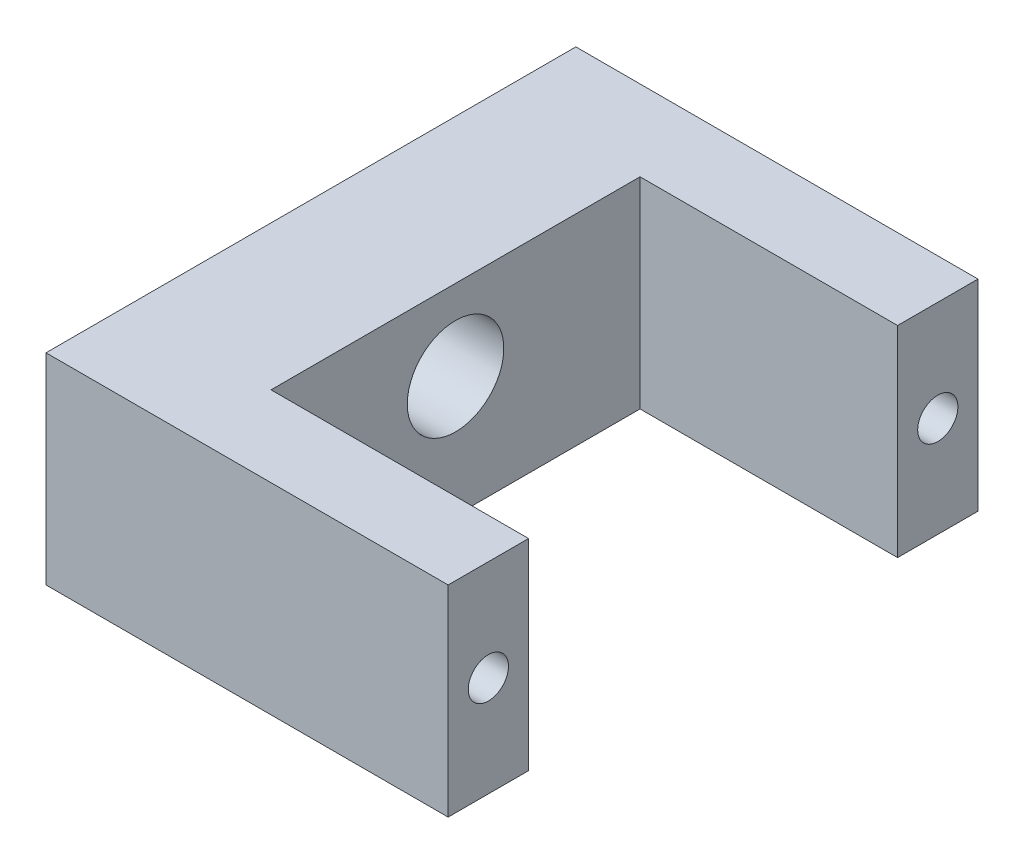
ISO-10303-21;
HEADER;
FILE_DESCRIPTION(('STEP AP214'),'2;1');
FILE_NAME('part.step','',(''),(''),'','','');
FILE_SCHEMA(('AUTOMOTIVE_DESIGN { 1 0 10303 214 1 1 1 1 }'));
ENDSEC;
DATA;
#1=APPLICATION_CONTEXT('core data for automotive mechanical design processes');
#2=APPLICATION_PROTOCOL_DEFINITION('international standard','automotive_design',2000,#1);
#3=PRODUCT_CONTEXT('',#1,'mechanical');
#4=PRODUCT('Part','Part','',(#3));
#5=PRODUCT_RELATED_PRODUCT_CATEGORY('part','',(#4));
#6=PRODUCT_DEFINITION_FORMATION('','',#4);
#7=PRODUCT_DEFINITION_CONTEXT('part definition',#1,'design');
#8=PRODUCT_DEFINITION('design','',#6,#7);
#9=PRODUCT_DEFINITION_SHAPE('','',#8);
#10=(LENGTH_UNIT() NAMED_UNIT(*) SI_UNIT(.MILLI.,.METRE.));
#11=(NAMED_UNIT(*) PLANE_ANGLE_UNIT() SI_UNIT($,.RADIAN.));
#12=(NAMED_UNIT(*) SI_UNIT($,.STERADIAN.) SOLID_ANGLE_UNIT());
#13=UNCERTAINTY_MEASURE_WITH_UNIT(LENGTH_MEASURE(1.E-05),#10,'distance_accuracy_value','');
#14=(GEOMETRIC_REPRESENTATION_CONTEXT(3) GLOBAL_UNCERTAINTY_ASSIGNED_CONTEXT((#13)) GLOBAL_UNIT_ASSIGNED_CONTEXT((#10,
#11,#12)) REPRESENTATION_CONTEXT('',''));
#15=CARTESIAN_POINT('',(0.,0.,0.));
#16=DIRECTION('',(0.,0.,1.));
#17=DIRECTION('',(1.,0.,0.));
#18=AXIS2_PLACEMENT_3D('',#15,#16,#17);
#19=CARTESIAN_POINT('',(25.,6.25,0.));
#20=DIRECTION('',(0.,0.,-1.));
#21=DIRECTION('',(-1.,0.,0.));
#22=AXIS2_PLACEMENT_3D('',#19,#20,#21);
#23=PLANE('',#22);
#24=DIRECTION('',(1.,0.,0.));
#25=VECTOR('',#24,1.);
#26=CARTESIAN_POINT('',(25.,-6.25,0.));
#27=LINE('',#26,#25);
#28=CARTESIAN_POINT('',(0.,-6.25,0.));
#29=VERTEX_POINT('',#28);
#30=CARTESIAN_POINT('',(25.,-6.25,0.));
#31=VERTEX_POINT('',#30);
#32=EDGE_CURVE('E131',#29,#31,#27,.T.);
#33=ORIENTED_EDGE('',*,*,#32,.T.);
#34=DIRECTION('',(0.,-1.,0.));
#35=VECTOR('',#34,1.);
#36=CARTESIAN_POINT('',(25.,6.25,0.));
#37=LINE('',#36,#35);
#38=CARTESIAN_POINT('',(25.,6.25,0.));
#39=VERTEX_POINT('',#38);
#40=EDGE_CURVE('E11',#39,#31,#37,.T.);
#41=ORIENTED_EDGE('',*,*,#40,.F.);
#42=DIRECTION('',(1.,0.,0.));
#43=VECTOR('',#42,1.);
#44=CARTESIAN_POINT('',(25.,6.25,0.));
#45=LINE('',#44,#43);
#46=CARTESIAN_POINT('',(0.,6.25,0.));
#47=VERTEX_POINT('',#46);
#48=EDGE_CURVE('E146',#47,#39,#45,.T.);
#49=ORIENTED_EDGE('',*,*,#48,.F.);
#50=DIRECTION('',(0.,-1.,0.));
#51=VECTOR('',#50,1.);
#52=CARTESIAN_POINT('',(0.,6.25,0.));
#53=LINE('',#52,#51);
#54=EDGE_CURVE('E127',#47,#29,#53,.T.);
#55=ORIENTED_EDGE('',*,*,#54,.T.);
#56=EDGE_LOOP('',(#33,#41,#49,#55));
#57=FACE_BOUND('',#56,.T.);
#58=ADVANCED_FACE('F35',(#57),#23,.F.);
#59=CARTESIAN_POINT('',(25.,6.25,-5.));
#60=DIRECTION('',(-1.,0.,0.));
#61=DIRECTION('',(0.,0.,1.));
#62=AXIS2_PLACEMENT_3D('',#59,#60,#61);
#63=PLANE('',#62);
#64=CARTESIAN_POINT('',(25.,0.,-2.50000000000001));
#65=DIRECTION('',(1.,0.,0.));
#66=DIRECTION('',(0.,0.,-1.));
#67=AXIS2_PLACEMENT_3D('',#64,#65,#66);
#68=CIRCLE('',#67,1.25);
#69=CARTESIAN_POINT('',(25.,0.,-3.75000000000001));
#70=VERTEX_POINT('',#69);
#71=EDGE_CURVE('E179',#70,#70,#68,.T.);
#72=ORIENTED_EDGE('',*,*,#71,.F.);
#73=EDGE_LOOP('',(#72));
#74=FACE_BOUND('',#73,.T.);
#75=DIRECTION('',(0.,0.,-1.));
#76=VECTOR('',#75,1.);
#77=CARTESIAN_POINT('',(25.,-6.25,-5.));
#78=LINE('',#77,#76);
#79=CARTESIAN_POINT('',(25.,-6.25,-5.));
#80=VERTEX_POINT('',#79);
#81=EDGE_CURVE('E134',#31,#80,#78,.T.);
#82=ORIENTED_EDGE('',*,*,#81,.T.);
#83=DIRECTION('',(0.,-1.,0.));
#84=VECTOR('',#83,1.);
#85=CARTESIAN_POINT('',(25.,6.25,-5.));
#86=LINE('',#85,#84);
#87=CARTESIAN_POINT('',(25.,6.25,-5.));
#88=VERTEX_POINT('',#87);
#89=EDGE_CURVE('E43',#88,#80,#86,.T.);
#90=ORIENTED_EDGE('',*,*,#89,.F.);
#91=DIRECTION('',(0.,0.,-1.));
#92=VECTOR('',#91,1.);
#93=CARTESIAN_POINT('',(25.,6.25,-5.));
#94=LINE('',#93,#92);
#95=EDGE_CURVE('E94',#39,#88,#94,.T.);
#96=ORIENTED_EDGE('',*,*,#95,.F.);
#97=ORIENTED_EDGE('',*,*,#40,.T.);
#98=EDGE_LOOP('',(#82,#90,#96,#97));
#99=FACE_BOUND('',#98,.T.);
#100=ADVANCED_FACE('F213',(#74,#99),#63,.F.);
#101=CARTESIAN_POINT('',(8.99,6.25,-5.));
#102=DIRECTION('',(0.,0.,1.));
#103=DIRECTION('',(1.,0.,0.));
#104=AXIS2_PLACEMENT_3D('',#101,#102,#103);
#105=PLANE('',#104);
#106=DIRECTION('',(-1.,0.,0.));
#107=VECTOR('',#106,1.);
#108=CARTESIAN_POINT('',(8.99,-6.25,-5.));
#109=LINE('',#108,#107);
#110=CARTESIAN_POINT('',(8.99,-6.25,-5.));
#111=VERTEX_POINT('',#110);
#112=EDGE_CURVE('E137',#80,#111,#109,.T.);
#113=ORIENTED_EDGE('',*,*,#112,.T.);
#114=DIRECTION('',(0.,-1.,0.));
#115=VECTOR('',#114,1.);
#116=CARTESIAN_POINT('',(8.99,6.25,-5.));
#117=LINE('',#116,#115);
#118=CARTESIAN_POINT('',(8.99,6.25,-5.));
#119=VERTEX_POINT('',#118);
#120=EDGE_CURVE('E153',#119,#111,#117,.T.);
#121=ORIENTED_EDGE('',*,*,#120,.F.);
#122=DIRECTION('',(-1.,0.,0.));
#123=VECTOR('',#122,1.);
#124=CARTESIAN_POINT('',(8.99,6.25,-5.));
#125=LINE('',#124,#123);
#126=EDGE_CURVE('E161',#88,#119,#125,.T.);
#127=ORIENTED_EDGE('',*,*,#126,.F.);
#128=ORIENTED_EDGE('',*,*,#89,.T.);
#129=EDGE_LOOP('',(#113,#121,#127,#128));
#130=FACE_BOUND('',#129,.T.);
#131=ADVANCED_FACE('F159',(#130),#105,.F.);
#132=CARTESIAN_POINT('',(8.98999999999999,6.25,-27.94));
#133=DIRECTION('',(-1.,0.,0.));
#134=DIRECTION('',(0.,0.,1.));
#135=AXIS2_PLACEMENT_3D('',#132,#133,#134);
#136=PLANE('',#135);
#137=CARTESIAN_POINT('',(8.99,1.25,-16.47));
#138=DIRECTION('',(-1.,0.,0.));
#139=DIRECTION('',(0.,0.,1.));
#140=AXIS2_PLACEMENT_3D('',#137,#138,#139);
#141=CIRCLE('',#140,3.);
#142=CARTESIAN_POINT('',(8.99,1.25,-13.47));
#143=VERTEX_POINT('',#142);
#144=EDGE_CURVE('E188',#143,#143,#141,.T.);
#145=ORIENTED_EDGE('',*,*,#144,.T.);
#146=EDGE_LOOP('',(#145));
#147=FACE_BOUND('',#146,.T.);
#148=DIRECTION('',(0.,0.,-1.));
#149=VECTOR('',#148,1.);
#150=CARTESIAN_POINT('',(8.98999999999999,-6.25,-27.94));
#151=LINE('',#150,#149);
#152=CARTESIAN_POINT('',(8.98999999999999,-6.25,-27.94));
#153=VERTEX_POINT('',#152);
#154=EDGE_CURVE('E139',#111,#153,#151,.T.);
#155=ORIENTED_EDGE('',*,*,#154,.T.);
#156=DIRECTION('',(0.,-1.,0.));
#157=VECTOR('',#156,1.);
#158=CARTESIAN_POINT('',(8.98999999999999,6.25,-27.94));
#159=LINE('',#158,#157);
#160=CARTESIAN_POINT('',(8.98999999999999,6.25,-27.94));
#161=VERTEX_POINT('',#160);
#162=EDGE_CURVE('E150',#161,#153,#159,.T.);
#163=ORIENTED_EDGE('',*,*,#162,.F.);
#164=DIRECTION('',(0.,0.,-1.));
#165=VECTOR('',#164,1.);
#166=CARTESIAN_POINT('',(8.98999999999999,6.25,-27.94));
#167=LINE('',#166,#165);
#168=EDGE_CURVE('E173',#119,#161,#167,.T.);
#169=ORIENTED_EDGE('',*,*,#168,.F.);
#170=ORIENTED_EDGE('',*,*,#120,.T.);
#171=EDGE_LOOP('',(#155,#163,#169,#170));
#172=FACE_BOUND('',#171,.T.);
#173=ADVANCED_FACE('F169',(#147,#172),#136,.F.);
#174=CARTESIAN_POINT('',(25.,6.25,-27.94));
#175=DIRECTION('',(0.,0.,-1.));
#176=DIRECTION('',(-1.,0.,0.));
#177=AXIS2_PLACEMENT_3D('',#174,#175,#176);
#178=PLANE('',#177);
#179=DIRECTION('',(1.,0.,0.));
#180=VECTOR('',#179,1.);
#181=CARTESIAN_POINT('',(25.,-6.25,-27.94));
#182=LINE('',#181,#180);
#183=CARTESIAN_POINT('',(25.,-6.25,-27.94));
#184=VERTEX_POINT('',#183);
#185=EDGE_CURVE('E141',#153,#184,#182,.T.);
#186=ORIENTED_EDGE('',*,*,#185,.T.);
#187=DIRECTION('',(0.,-1.,0.));
#188=VECTOR('',#187,1.);
#189=CARTESIAN_POINT('',(25.,6.25,-27.94));
#190=LINE('',#189,#188);
#191=CARTESIAN_POINT('',(25.,6.25,-27.94));
#192=VERTEX_POINT('',#191);
#193=EDGE_CURVE('E122',#192,#184,#190,.T.);
#194=ORIENTED_EDGE('',*,*,#193,.F.);
#195=DIRECTION('',(1.,0.,0.));
#196=VECTOR('',#195,1.);
#197=CARTESIAN_POINT('',(25.,6.25,-27.94));
#198=LINE('',#197,#196);
#199=EDGE_CURVE('E113',#161,#192,#198,.T.);
#200=ORIENTED_EDGE('',*,*,#199,.F.);
#201=ORIENTED_EDGE('',*,*,#162,.T.);
#202=EDGE_LOOP('',(#186,#194,#200,#201));
#203=FACE_BOUND('',#202,.T.);
#204=ADVANCED_FACE('F172',(#203),#178,.F.);
#205=CARTESIAN_POINT('',(25.,6.25,-32.94));
#206=DIRECTION('',(-1.,0.,0.));
#207=DIRECTION('',(0.,0.,1.));
#208=AXIS2_PLACEMENT_3D('',#205,#206,#207);
#209=PLANE('',#208);
#210=CARTESIAN_POINT('',(25.,0.,-30.44));
#211=DIRECTION('',(-1.,0.,0.));
#212=DIRECTION('',(0.,0.,1.));
#213=AXIS2_PLACEMENT_3D('',#210,#211,#212);
#214=CIRCLE('',#213,1.25);
#215=CARTESIAN_POINT('',(25.,0.,-29.19));
#216=VERTEX_POINT('',#215);
#217=EDGE_CURVE('E185',#216,#216,#214,.T.);
#218=ORIENTED_EDGE('',*,*,#217,.T.);
#219=EDGE_LOOP('',(#218));
#220=FACE_BOUND('',#219,.T.);
#221=DIRECTION('',(0.,0.,-1.));
#222=VECTOR('',#221,1.);
#223=CARTESIAN_POINT('',(25.,-6.25,-32.94));
#224=LINE('',#223,#222);
#225=CARTESIAN_POINT('',(25.,-6.25,-32.94));
#226=VERTEX_POINT('',#225);
#227=EDGE_CURVE('E121',#184,#226,#224,.T.);
#228=ORIENTED_EDGE('',*,*,#227,.T.);
#229=DIRECTION('',(0.,-1.,0.));
#230=VECTOR('',#229,1.);
#231=CARTESIAN_POINT('',(25.,6.25,-32.94));
#232=LINE('',#231,#230);
#233=CARTESIAN_POINT('',(25.,6.25,-32.94));
#234=VERTEX_POINT('',#233);
#235=EDGE_CURVE('E118',#234,#226,#232,.T.);
#236=ORIENTED_EDGE('',*,*,#235,.F.);
#237=DIRECTION('',(0.,0.,-1.));
#238=VECTOR('',#237,1.);
#239=CARTESIAN_POINT('',(25.,6.25,-32.94));
#240=LINE('',#239,#238);
#241=EDGE_CURVE('E107',#192,#234,#240,.T.);
#242=ORIENTED_EDGE('',*,*,#241,.F.);
#243=ORIENTED_EDGE('',*,*,#193,.T.);
#244=EDGE_LOOP('',(#228,#236,#242,#243));
#245=FACE_BOUND('',#244,.T.);
#246=ADVANCED_FACE('F119',(#220,#245),#209,.F.);
#247=CARTESIAN_POINT('',(0.,6.25,-32.94));
#248=DIRECTION('',(0.,0.,1.));
#249=DIRECTION('',(1.,0.,0.));
#250=AXIS2_PLACEMENT_3D('',#247,#248,#249);
#251=PLANE('',#250);
#252=DIRECTION('',(-1.,0.,0.));
#253=VECTOR('',#252,1.);
#254=CARTESIAN_POINT('',(0.,-6.25,-32.94));
#255=LINE('',#254,#253);
#256=CARTESIAN_POINT('',(0.,-6.25,-32.94));
#257=VERTEX_POINT('',#256);
#258=EDGE_CURVE('E80',#226,#257,#255,.T.);
#259=ORIENTED_EDGE('',*,*,#258,.T.);
#260=DIRECTION('',(0.,-1.,0.));
#261=VECTOR('',#260,1.);
#262=CARTESIAN_POINT('',(0.,6.25,-32.94));
#263=LINE('',#262,#261);
#264=CARTESIAN_POINT('',(0.,6.25,-32.94));
#265=VERTEX_POINT('',#264);
#266=EDGE_CURVE('E123',#265,#257,#263,.T.);
#267=ORIENTED_EDGE('',*,*,#266,.F.);
#268=DIRECTION('',(-1.,0.,0.));
#269=VECTOR('',#268,1.);
#270=CARTESIAN_POINT('',(0.,6.25,-32.94));
#271=LINE('',#270,#269);
#272=EDGE_CURVE('E111',#234,#265,#271,.T.);
#273=ORIENTED_EDGE('',*,*,#272,.F.);
#274=ORIENTED_EDGE('',*,*,#235,.T.);
#275=EDGE_LOOP('',(#259,#267,#273,#274));
#276=FACE_BOUND('',#275,.T.);
#277=ADVANCED_FACE('F125',(#276),#251,.F.);
#278=CARTESIAN_POINT('',(0.,6.25,0.));
#279=DIRECTION('',(1.,0.,0.));
#280=DIRECTION('',(0.,0.,-1.));
#281=AXIS2_PLACEMENT_3D('',#278,#279,#280);
#282=PLANE('',#281);
#283=CARTESIAN_POINT('',(0.,1.25,-16.47));
#284=DIRECTION('',(-1.,0.,0.));
#285=DIRECTION('',(0.,0.,1.));
#286=AXIS2_PLACEMENT_3D('',#283,#284,#285);
#287=CIRCLE('',#286,3.);
#288=CARTESIAN_POINT('',(0.,1.25,-13.47));
#289=VERTEX_POINT('',#288);
#290=EDGE_CURVE('E193',#289,#289,#287,.T.);
#291=ORIENTED_EDGE('',*,*,#290,.F.);
#292=EDGE_LOOP('',(#291));
#293=FACE_BOUND('',#292,.T.);
#294=DIRECTION('',(0.,0.,1.));
#295=VECTOR('',#294,1.);
#296=CARTESIAN_POINT('',(0.,-6.25,0.));
#297=LINE('',#296,#295);
#298=EDGE_CURVE('E86',#257,#29,#297,.T.);
#299=ORIENTED_EDGE('',*,*,#298,.T.);
#300=ORIENTED_EDGE('',*,*,#54,.F.);
#301=DIRECTION('',(0.,0.,1.));
#302=VECTOR('',#301,1.);
#303=CARTESIAN_POINT('',(0.,6.25,0.));
#304=LINE('',#303,#302);
#305=EDGE_CURVE('E51',#265,#47,#304,.T.);
#306=ORIENTED_EDGE('',*,*,#305,.F.);
#307=ORIENTED_EDGE('',*,*,#266,.T.);
#308=EDGE_LOOP('',(#299,#300,#306,#307));
#309=FACE_BOUND('',#308,.T.);
#310=ADVANCED_FACE('F200',(#293,#309),#282,.F.);
#311=CARTESIAN_POINT('',(0.,6.25,0.));
#312=DIRECTION('',(0.,-1.,0.));
#313=DIRECTION('',(0.,0.,-1.));
#314=AXIS2_PLACEMENT_3D('',#311,#312,#313);
#315=PLANE('',#314);
#316=ORIENTED_EDGE('',*,*,#48,.T.);
#317=ORIENTED_EDGE('',*,*,#95,.T.);
#318=ORIENTED_EDGE('',*,*,#126,.T.);
#319=ORIENTED_EDGE('',*,*,#168,.T.);
#320=ORIENTED_EDGE('',*,*,#199,.T.);
#321=ORIENTED_EDGE('',*,*,#241,.T.);
#322=ORIENTED_EDGE('',*,*,#272,.T.);
#323=ORIENTED_EDGE('',*,*,#305,.T.);
#324=EDGE_LOOP('',(#316,#317,#318,#319,#320,#321,#322,#323));
#325=FACE_BOUND('',#324,.T.);
#326=ADVANCED_FACE('F109',(#325),#315,.F.);
#327=CARTESIAN_POINT('',(0.,-6.25,0.));
#328=DIRECTION('',(0.,-1.,0.));
#329=DIRECTION('',(0.,0.,-1.));
#330=AXIS2_PLACEMENT_3D('',#327,#328,#329);
#331=PLANE('',#330);
#332=ORIENTED_EDGE('',*,*,#32,.F.);
#333=ORIENTED_EDGE('',*,*,#298,.F.);
#334=ORIENTED_EDGE('',*,*,#258,.F.);
#335=ORIENTED_EDGE('',*,*,#227,.F.);
#336=ORIENTED_EDGE('',*,*,#185,.F.);
#337=ORIENTED_EDGE('',*,*,#154,.F.);
#338=ORIENTED_EDGE('',*,*,#112,.F.);
#339=ORIENTED_EDGE('',*,*,#81,.F.);
#340=EDGE_LOOP('',(#332,#333,#334,#335,#336,#337,#338,#339));
#341=FACE_BOUND('',#340,.T.);
#342=ADVANCED_FACE('F165',(#341),#331,.T.);
#343=CARTESIAN_POINT('',(12.5,0.,-2.50000000000002));
#344=DIRECTION('',(1.,0.,0.));
#345=DIRECTION('',(0.,0.,-1.));
#346=AXIS2_PLACEMENT_3D('',#343,#344,#345);
#347=CYLINDRICAL_SURFACE('',#346,1.25);
#348=CARTESIAN_POINT('',(12.5,0.,-2.50000000000002));
#349=DIRECTION('',(1.,0.,0.));
#350=DIRECTION('',(0.,0.,-1.));
#351=AXIS2_PLACEMENT_3D('',#348,#349,#350);
#352=CIRCLE('',#351,1.25);
#353=CARTESIAN_POINT('',(12.5,0.,-3.75000000000002));
#354=VERTEX_POINT('',#353);
#355=EDGE_CURVE('E135',#354,#354,#352,.T.);
#356=ORIENTED_EDGE('',*,*,#355,.F.);
#357=EDGE_LOOP('',(#356));
#358=FACE_BOUND('',#357,.T.);
#359=ORIENTED_EDGE('',*,*,#71,.T.);
#360=EDGE_LOOP('',(#359));
#361=FACE_BOUND('',#360,.T.);
#362=ADVANCED_FACE('F249',(#358,#361),#347,.F.);
#363=CARTESIAN_POINT('',(12.5,0.,-2.50000000000002));
#364=DIRECTION('',(1.,0.,0.));
#365=DIRECTION('',(0.,0.,-1.));
#366=AXIS2_PLACEMENT_3D('',#363,#364,#365);
#367=PLANE('',#366);
#368=ORIENTED_EDGE('',*,*,#355,.T.);
#369=EDGE_LOOP('',(#368));
#370=FACE_BOUND('',#369,.T.);
#371=ADVANCED_FACE('F240',(#370),#367,.T.);
#372=CARTESIAN_POINT('',(12.5,0.,-30.44));
#373=DIRECTION('',(1.,0.,0.));
#374=DIRECTION('',(0.,0.,-1.));
#375=AXIS2_PLACEMENT_3D('',#372,#373,#374);
#376=CYLINDRICAL_SURFACE('',#375,1.25);
#377=CARTESIAN_POINT('',(12.5,0.,-30.44));
#378=DIRECTION('',(-1.,0.,0.));
#379=DIRECTION('',(0.,0.,1.));
#380=AXIS2_PLACEMENT_3D('',#377,#378,#379);
#381=CIRCLE('',#380,1.25);
#382=CARTESIAN_POINT('',(12.5,0.,-29.19));
#383=VERTEX_POINT('',#382);
#384=EDGE_CURVE('E182',#383,#383,#381,.T.);
#385=ORIENTED_EDGE('',*,*,#384,.T.);
#386=EDGE_LOOP('',(#385));
#387=FACE_BOUND('',#386,.T.);
#388=ORIENTED_EDGE('',*,*,#217,.F.);
#389=EDGE_LOOP('',(#388));
#390=FACE_BOUND('',#389,.T.);
#391=ADVANCED_FACE('F237',(#387,#390),#376,.F.);
#392=CARTESIAN_POINT('',(12.5,0.,-30.44));
#393=DIRECTION('',(1.,0.,0.));
#394=DIRECTION('',(0.,0.,1.));
#395=AXIS2_PLACEMENT_3D('',#392,#393,#394);
#396=PLANE('',#395);
#397=ORIENTED_EDGE('',*,*,#384,.F.);
#398=EDGE_LOOP('',(#397));
#399=FACE_BOUND('',#398,.T.);
#400=ADVANCED_FACE('F239',(#399),#396,.T.);
#401=CARTESIAN_POINT('',(10.,1.25,-16.47));
#402=DIRECTION('',(-1.,0.,0.));
#403=DIRECTION('',(0.,0.,1.));
#404=AXIS2_PLACEMENT_3D('',#401,#402,#403);
#405=CYLINDRICAL_SURFACE('',#404,3.);
#406=ORIENTED_EDGE('',*,*,#290,.T.);
#407=EDGE_LOOP('',(#406));
#408=FACE_BOUND('',#407,.T.);
#409=ORIENTED_EDGE('',*,*,#144,.F.);
#410=EDGE_LOOP('',(#409));
#411=FACE_BOUND('',#410,.T.);
#412=ADVANCED_FACE('F197',(#408,#411),#405,.F.);
#413=CLOSED_SHELL('',(#58,#100,#131,#173,#204,#246,#277,#310,#326,#342,#362,#371,#391,#400,#412));
#414=MANIFOLD_SOLID_BREP('B2',#413);
#415=ADVANCED_BREP_SHAPE_REPRESENTATION('',(#18,#414),#14);
#416=SHAPE_DEFINITION_REPRESENTATION(#9,#415);
ENDSEC;
END-ISO-10303-21;
